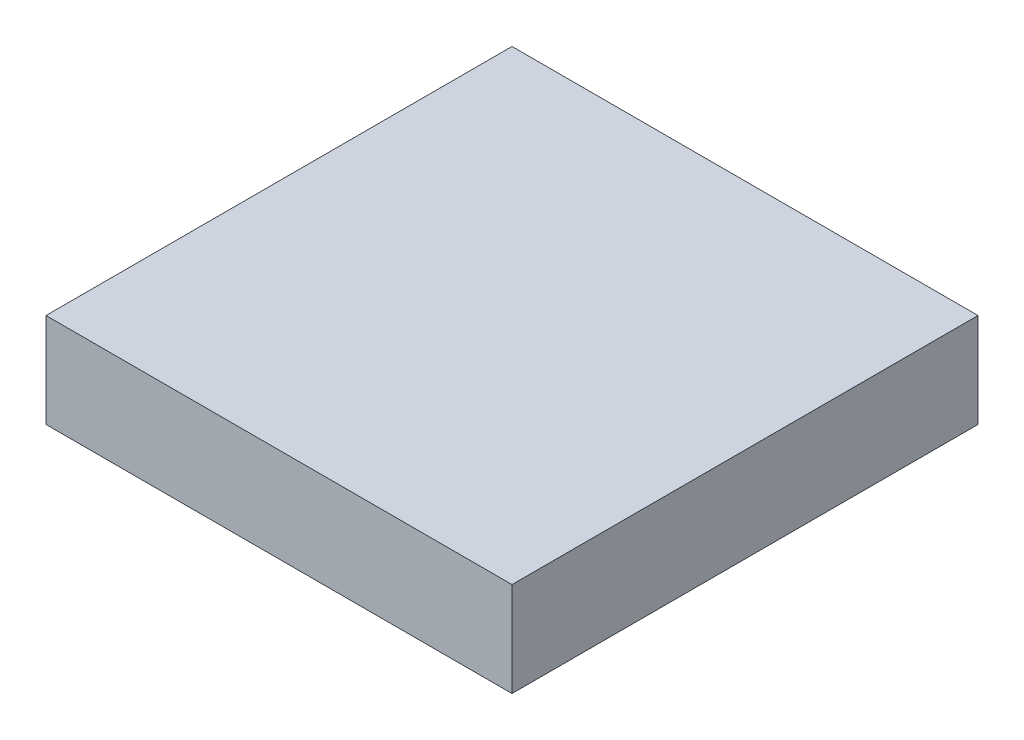
ISO-10303-21;
HEADER;
FILE_DESCRIPTION(('STEP AP214'),'2;1');
FILE_NAME('part.step','',(''),(''),'','','');
FILE_SCHEMA(('AUTOMOTIVE_DESIGN { 1 0 10303 214 1 1 1 1 }'));
ENDSEC;
DATA;
#1=APPLICATION_CONTEXT('core data for automotive mechanical design processes');
#2=APPLICATION_PROTOCOL_DEFINITION('international standard','automotive_design',2000,#1);
#3=PRODUCT_CONTEXT('',#1,'mechanical');
#4=PRODUCT('Part','Part','',(#3));
#5=PRODUCT_RELATED_PRODUCT_CATEGORY('part','',(#4));
#6=PRODUCT_DEFINITION_FORMATION('','',#4);
#7=PRODUCT_DEFINITION_CONTEXT('part definition',#1,'design');
#8=PRODUCT_DEFINITION('design','',#6,#7);
#9=PRODUCT_DEFINITION_SHAPE('','',#8);
#10=(LENGTH_UNIT() NAMED_UNIT(*) SI_UNIT(.MILLI.,.METRE.));
#11=(NAMED_UNIT(*) PLANE_ANGLE_UNIT() SI_UNIT($,.RADIAN.));
#12=(NAMED_UNIT(*) SI_UNIT($,.STERADIAN.) SOLID_ANGLE_UNIT());
#13=UNCERTAINTY_MEASURE_WITH_UNIT(LENGTH_MEASURE(1.E-05),#10,'distance_accuracy_value','');
#14=(GEOMETRIC_REPRESENTATION_CONTEXT(3) GLOBAL_UNCERTAINTY_ASSIGNED_CONTEXT((#13)) GLOBAL_UNIT_ASSIGNED_CONTEXT((#10,
#11,#12)) REPRESENTATION_CONTEXT('',''));
#15=CARTESIAN_POINT('',(0.,0.,0.));
#16=DIRECTION('',(0.,0.,1.));
#17=DIRECTION('',(1.,0.,0.));
#18=AXIS2_PLACEMENT_3D('',#15,#16,#17);
#19=CARTESIAN_POINT('',(0.,0.,0.));
#20=DIRECTION('',(0.,1.,0.));
#21=DIRECTION('',(0.,0.,1.));
#22=AXIS2_PLACEMENT_3D('',#19,#20,#21);
#23=PLANE('',#22);
#24=CARTESIAN_POINT('',(4.,0.,-4.));
#25=DIRECTION('',(0.,1.,0.));
#26=DIRECTION('',(0.,0.,1.));
#27=AXIS2_PLACEMENT_3D('',#24,#25,#26);
#28=CIRCLE('',#27,2.5);
#29=CARTESIAN_POINT('',(4.,0.,-1.5));
#30=VERTEX_POINT('',#29);
#31=EDGE_CURVE('E247',#30,#30,#28,.T.);
#32=ORIENTED_EDGE('',*,*,#31,.T.);
#33=EDGE_LOOP('',(#32));
#34=FACE_BOUND('',#33,.T.);
#35=CARTESIAN_POINT('',(-3.99999999999991,0.,4.00000000000005));
#36=DIRECTION('',(0.,1.,0.));
#37=DIRECTION('',(0.,0.,1.));
#38=AXIS2_PLACEMENT_3D('',#35,#36,#37);
#39=CIRCLE('',#38,2.5);
#40=CARTESIAN_POINT('',(-3.99999999999991,0.,6.50000000000005));
#41=VERTEX_POINT('',#40);
#42=EDGE_CURVE('E261',#41,#41,#39,.T.);
#43=ORIENTED_EDGE('',*,*,#42,.T.);
#44=EDGE_LOOP('',(#43));
#45=FACE_BOUND('',#44,.T.);
#46=DIRECTION('',(0.,0.,1.));
#47=VECTOR('',#46,1.);
#48=CARTESIAN_POINT('',(7.9,0.,0.));
#49=LINE('',#48,#47);
#50=CARTESIAN_POINT('',(7.9,0.,-7.9));
#51=VERTEX_POINT('',#50);
#52=CARTESIAN_POINT('',(7.9,0.,7.9));
#53=VERTEX_POINT('',#52);
#54=EDGE_CURVE('E102',#51,#53,#49,.T.);
#55=ORIENTED_EDGE('',*,*,#54,.T.);
#56=DIRECTION('',(1.,0.,0.));
#57=VECTOR('',#56,1.);
#58=CARTESIAN_POINT('',(0.,0.,7.9));
#59=LINE('',#58,#57);
#60=CARTESIAN_POINT('',(-7.9,0.,7.9));
#61=VERTEX_POINT('',#60);
#62=EDGE_CURVE('E97',#61,#53,#59,.T.);
#63=ORIENTED_EDGE('',*,*,#62,.F.);
#64=DIRECTION('',(0.,0.,1.));
#65=VECTOR('',#64,1.);
#66=CARTESIAN_POINT('',(-7.9,0.,0.));
#67=LINE('',#66,#65);
#68=CARTESIAN_POINT('',(-7.9,0.,-7.9));
#69=VERTEX_POINT('',#68);
#70=EDGE_CURVE('E69',#69,#61,#67,.T.);
#71=ORIENTED_EDGE('',*,*,#70,.F.);
#72=DIRECTION('',(1.,0.,0.));
#73=VECTOR('',#72,1.);
#74=CARTESIAN_POINT('',(0.,0.,-7.9));
#75=LINE('',#74,#73);
#76=EDGE_CURVE('E89',#69,#51,#75,.T.);
#77=ORIENTED_EDGE('',*,*,#76,.T.);
#78=EDGE_LOOP('',(#55,#63,#71,#77));
#79=FACE_BOUND('',#78,.T.);
#80=CARTESIAN_POINT('',(4.00000000000009,0.,4.));
#81=DIRECTION('',(0.,1.,0.));
#82=DIRECTION('',(0.,0.,1.));
#83=AXIS2_PLACEMENT_3D('',#80,#81,#82);
#84=CIRCLE('',#83,2.5);
#85=CARTESIAN_POINT('',(4.00000000000009,0.,6.5));
#86=VERTEX_POINT('',#85);
#87=EDGE_CURVE('E256',#86,#86,#84,.T.);
#88=ORIENTED_EDGE('',*,*,#87,.T.);
#89=EDGE_LOOP('',(#88));
#90=FACE_BOUND('',#89,.T.);
#91=CARTESIAN_POINT('',(-4.,0.,-3.99999999999995));
#92=DIRECTION('',(0.,1.,0.));
#93=DIRECTION('',(0.,0.,1.));
#94=AXIS2_PLACEMENT_3D('',#91,#92,#93);
#95=CIRCLE('',#94,2.5);
#96=CARTESIAN_POINT('',(-4.,0.,-1.49999999999995));
#97=VERTEX_POINT('',#96);
#98=EDGE_CURVE('E248',#97,#97,#95,.T.);
#99=ORIENTED_EDGE('',*,*,#98,.T.);
#100=EDGE_LOOP('',(#99));
#101=FACE_BOUND('',#100,.T.);
#102=ADVANCED_FACE('F37',(#34,#45,#79,#90,#101),#23,.F.);
#103=CARTESIAN_POINT('',(7.9,3.2,0.));
#104=DIRECTION('',(1.,0.,0.));
#105=DIRECTION('',(0.,0.,-1.));
#106=AXIS2_PLACEMENT_3D('',#103,#104,#105);
#107=PLANE('',#106);
#108=ORIENTED_EDGE('',*,*,#54,.F.);
#109=DIRECTION('',(0.,-1.,0.));
#110=VECTOR('',#109,1.);
#111=CARTESIAN_POINT('',(7.9,3.2,-7.9));
#112=LINE('',#111,#110);
#113=CARTESIAN_POINT('',(7.9,3.2,-7.9));
#114=VERTEX_POINT('',#113);
#115=EDGE_CURVE('E11',#114,#51,#112,.T.);
#116=ORIENTED_EDGE('',*,*,#115,.F.);
#117=DIRECTION('',(0.,0.,1.));
#118=VECTOR('',#117,1.);
#119=CARTESIAN_POINT('',(7.9,3.2,0.));
#120=LINE('',#119,#118);
#121=CARTESIAN_POINT('',(7.9,3.2,7.9));
#122=VERTEX_POINT('',#121);
#123=EDGE_CURVE('E95',#114,#122,#120,.T.);
#124=ORIENTED_EDGE('',*,*,#123,.T.);
#125=DIRECTION('',(0.,-1.,0.));
#126=VECTOR('',#125,1.);
#127=CARTESIAN_POINT('',(7.9,3.2,7.9));
#128=LINE('',#127,#126);
#129=EDGE_CURVE('E76',#122,#53,#128,.T.);
#130=ORIENTED_EDGE('',*,*,#129,.T.);
#131=EDGE_LOOP('',(#108,#116,#124,#130));
#132=FACE_BOUND('',#131,.T.);
#133=ADVANCED_FACE('F39',(#132),#107,.T.);
#134=CARTESIAN_POINT('',(0.,3.2,-7.9));
#135=DIRECTION('',(0.,0.,-1.));
#136=DIRECTION('',(-1.,0.,0.));
#137=AXIS2_PLACEMENT_3D('',#134,#135,#136);
#138=PLANE('',#137);
#139=ORIENTED_EDGE('',*,*,#76,.F.);
#140=DIRECTION('',(0.,-1.,0.));
#141=VECTOR('',#140,1.);
#142=CARTESIAN_POINT('',(-7.9,3.2,-7.9));
#143=LINE('',#142,#141);
#144=CARTESIAN_POINT('',(-7.9,3.2,-7.9));
#145=VERTEX_POINT('',#144);
#146=EDGE_CURVE('E46',#145,#69,#143,.T.);
#147=ORIENTED_EDGE('',*,*,#146,.F.);
#148=DIRECTION('',(1.,0.,0.));
#149=VECTOR('',#148,1.);
#150=CARTESIAN_POINT('',(0.,3.2,-7.9));
#151=LINE('',#150,#149);
#152=EDGE_CURVE('E87',#145,#114,#151,.T.);
#153=ORIENTED_EDGE('',*,*,#152,.T.);
#154=ORIENTED_EDGE('',*,*,#115,.T.);
#155=EDGE_LOOP('',(#139,#147,#153,#154));
#156=FACE_BOUND('',#155,.T.);
#157=ADVANCED_FACE('F85',(#156),#138,.T.);
#158=CARTESIAN_POINT('',(-7.9,3.2,0.));
#159=DIRECTION('',(1.,0.,0.));
#160=DIRECTION('',(0.,0.,-1.));
#161=AXIS2_PLACEMENT_3D('',#158,#159,#160);
#162=PLANE('',#161);
#163=ORIENTED_EDGE('',*,*,#70,.T.);
#164=DIRECTION('',(0.,-1.,0.));
#165=VECTOR('',#164,1.);
#166=CARTESIAN_POINT('',(-7.9,3.2,7.9));
#167=LINE('',#166,#165);
#168=CARTESIAN_POINT('',(-7.9,3.2,7.9));
#169=VERTEX_POINT('',#168);
#170=EDGE_CURVE('E90',#169,#61,#167,.T.);
#171=ORIENTED_EDGE('',*,*,#170,.F.);
#172=DIRECTION('',(0.,0.,1.));
#173=VECTOR('',#172,1.);
#174=CARTESIAN_POINT('',(-7.9,3.2,0.));
#175=LINE('',#174,#173);
#176=EDGE_CURVE('E91',#145,#169,#175,.T.);
#177=ORIENTED_EDGE('',*,*,#176,.F.);
#178=ORIENTED_EDGE('',*,*,#146,.T.);
#179=EDGE_LOOP('',(#163,#171,#177,#178));
#180=FACE_BOUND('',#179,.T.);
#181=ADVANCED_FACE('F92',(#180),#162,.F.);
#182=CARTESIAN_POINT('',(0.,3.2,7.9));
#183=DIRECTION('',(0.,0.,-1.));
#184=DIRECTION('',(-1.,0.,0.));
#185=AXIS2_PLACEMENT_3D('',#182,#183,#184);
#186=PLANE('',#185);
#187=ORIENTED_EDGE('',*,*,#62,.T.);
#188=ORIENTED_EDGE('',*,*,#129,.F.);
#189=DIRECTION('',(1.,0.,0.));
#190=VECTOR('',#189,1.);
#191=CARTESIAN_POINT('',(0.,3.2,7.9));
#192=LINE('',#191,#190);
#193=EDGE_CURVE('E54',#169,#122,#192,.T.);
#194=ORIENTED_EDGE('',*,*,#193,.F.);
#195=ORIENTED_EDGE('',*,*,#170,.T.);
#196=EDGE_LOOP('',(#187,#188,#194,#195));
#197=FACE_BOUND('',#196,.T.);
#198=ADVANCED_FACE('F112',(#197),#186,.F.);
#199=CARTESIAN_POINT('',(0.,3.2,0.));
#200=DIRECTION('',(0.,1.,0.));
#201=DIRECTION('',(0.,0.,1.));
#202=AXIS2_PLACEMENT_3D('',#199,#200,#201);
#203=PLANE('',#202);
#204=ORIENTED_EDGE('',*,*,#123,.F.);
#205=ORIENTED_EDGE('',*,*,#152,.F.);
#206=ORIENTED_EDGE('',*,*,#176,.T.);
#207=ORIENTED_EDGE('',*,*,#193,.T.);
#208=EDGE_LOOP('',(#204,#205,#206,#207));
#209=FACE_BOUND('',#208,.T.);
#210=ADVANCED_FACE('F94',(#209),#203,.T.);
#211=CARTESIAN_POINT('',(-3.99999999999991,1.8,4.00000000000005));
#212=DIRECTION('',(0.,-1.,0.));
#213=DIRECTION('',(0.,0.,-1.));
#214=AXIS2_PLACEMENT_3D('',#211,#212,#213);
#215=CYLINDRICAL_SURFACE('',#214,2.5);
#216=CARTESIAN_POINT('',(-3.99999999999991,1.8,4.00000000000005));
#217=DIRECTION('',(0.,1.,0.));
#218=DIRECTION('',(0.,0.,1.));
#219=AXIS2_PLACEMENT_3D('',#216,#217,#218);
#220=CIRCLE('',#219,2.5);
#221=CARTESIAN_POINT('',(-3.99999999999991,1.8,6.50000000000005));
#222=VERTEX_POINT('',#221);
#223=EDGE_CURVE('E105',#222,#222,#220,.T.);
#224=ORIENTED_EDGE('',*,*,#223,.T.);
#225=EDGE_LOOP('',(#224));
#226=FACE_BOUND('',#225,.T.);
#227=ORIENTED_EDGE('',*,*,#42,.F.);
#228=EDGE_LOOP('',(#227));
#229=FACE_BOUND('',#228,.T.);
#230=ADVANCED_FACE('F146',(#226,#229),#215,.F.);
#231=CARTESIAN_POINT('',(0.,1.8,0.));
#232=DIRECTION('',(0.,1.,0.));
#233=DIRECTION('',(0.,0.,1.));
#234=AXIS2_PLACEMENT_3D('',#231,#232,#233);
#235=PLANE('',#234);
#236=ORIENTED_EDGE('',*,*,#223,.F.);
#237=EDGE_LOOP('',(#236));
#238=FACE_BOUND('',#237,.T.);
#239=ADVANCED_FACE('F152',(#238),#235,.F.);
#240=CARTESIAN_POINT('',(4.00000000000009,1.8,4.));
#241=DIRECTION('',(0.,-1.,0.));
#242=DIRECTION('',(0.,0.,-1.));
#243=AXIS2_PLACEMENT_3D('',#240,#241,#242);
#244=CYLINDRICAL_SURFACE('',#243,2.5);
#245=CARTESIAN_POINT('',(4.00000000000009,1.8,4.));
#246=DIRECTION('',(0.,1.,0.));
#247=DIRECTION('',(0.,0.,1.));
#248=AXIS2_PLACEMENT_3D('',#245,#246,#247);
#249=CIRCLE('',#248,2.5);
#250=CARTESIAN_POINT('',(4.00000000000009,1.8,6.5));
#251=VERTEX_POINT('',#250);
#252=EDGE_CURVE('E258',#251,#251,#249,.T.);
#253=ORIENTED_EDGE('',*,*,#252,.T.);
#254=EDGE_LOOP('',(#253));
#255=FACE_BOUND('',#254,.T.);
#256=ORIENTED_EDGE('',*,*,#87,.F.);
#257=EDGE_LOOP('',(#256));
#258=FACE_BOUND('',#257,.T.);
#259=ADVANCED_FACE('F159',(#255,#258),#244,.F.);
#260=CARTESIAN_POINT('',(0.,1.8,0.));
#261=DIRECTION('',(0.,1.,0.));
#262=DIRECTION('',(0.,0.,1.));
#263=AXIS2_PLACEMENT_3D('',#260,#261,#262);
#264=PLANE('',#263);
#265=ORIENTED_EDGE('',*,*,#252,.F.);
#266=EDGE_LOOP('',(#265));
#267=FACE_BOUND('',#266,.T.);
#268=ADVANCED_FACE('F167',(#267),#264,.F.);
#269=CARTESIAN_POINT('',(4.,1.8,-4.));
#270=DIRECTION('',(0.,-1.,0.));
#271=DIRECTION('',(0.,0.,-1.));
#272=AXIS2_PLACEMENT_3D('',#269,#270,#271);
#273=CYLINDRICAL_SURFACE('',#272,2.5);
#274=CARTESIAN_POINT('',(4.,1.8,-4.));
#275=DIRECTION('',(0.,1.,0.));
#276=DIRECTION('',(0.,0.,1.));
#277=AXIS2_PLACEMENT_3D('',#274,#275,#276);
#278=CIRCLE('',#277,2.5);
#279=CARTESIAN_POINT('',(4.,1.8,-1.5));
#280=VERTEX_POINT('',#279);
#281=EDGE_CURVE('E250',#280,#280,#278,.T.);
#282=ORIENTED_EDGE('',*,*,#281,.T.);
#283=EDGE_LOOP('',(#282));
#284=FACE_BOUND('',#283,.T.);
#285=ORIENTED_EDGE('',*,*,#31,.F.);
#286=EDGE_LOOP('',(#285));
#287=FACE_BOUND('',#286,.T.);
#288=ADVANCED_FACE('F175',(#284,#287),#273,.F.);
#289=CARTESIAN_POINT('',(0.,1.8,0.));
#290=DIRECTION('',(0.,1.,0.));
#291=DIRECTION('',(0.,0.,1.));
#292=AXIS2_PLACEMENT_3D('',#289,#290,#291);
#293=PLANE('',#292);
#294=ORIENTED_EDGE('',*,*,#281,.F.);
#295=EDGE_LOOP('',(#294));
#296=FACE_BOUND('',#295,.T.);
#297=ADVANCED_FACE('F183',(#296),#293,.F.);
#298=CARTESIAN_POINT('',(-4.,1.8,-3.99999999999995));
#299=DIRECTION('',(0.,-1.,0.));
#300=DIRECTION('',(0.,0.,-1.));
#301=AXIS2_PLACEMENT_3D('',#298,#299,#300);
#302=CYLINDRICAL_SURFACE('',#301,2.5);
#303=CARTESIAN_POINT('',(-4.,1.8,-3.99999999999995));
#304=DIRECTION('',(0.,1.,0.));
#305=DIRECTION('',(0.,0.,1.));
#306=AXIS2_PLACEMENT_3D('',#303,#304,#305);
#307=CIRCLE('',#306,2.5);
#308=CARTESIAN_POINT('',(-4.,1.8,-1.49999999999995));
#309=VERTEX_POINT('',#308);
#310=EDGE_CURVE('E246',#309,#309,#307,.T.);
#311=ORIENTED_EDGE('',*,*,#310,.T.);
#312=EDGE_LOOP('',(#311));
#313=FACE_BOUND('',#312,.T.);
#314=ORIENTED_EDGE('',*,*,#98,.F.);
#315=EDGE_LOOP('',(#314));
#316=FACE_BOUND('',#315,.T.);
#317=ADVANCED_FACE('F191',(#313,#316),#302,.F.);
#318=CARTESIAN_POINT('',(0.,1.8,0.));
#319=DIRECTION('',(0.,1.,0.));
#320=DIRECTION('',(0.,0.,1.));
#321=AXIS2_PLACEMENT_3D('',#318,#319,#320);
#322=PLANE('',#321);
#323=ORIENTED_EDGE('',*,*,#310,.F.);
#324=EDGE_LOOP('',(#323));
#325=FACE_BOUND('',#324,.T.);
#326=ADVANCED_FACE('F199',(#325),#322,.F.);
#327=CLOSED_SHELL('',(#102,#133,#157,#181,#198,#210,#230,#239,#259,#268,#288,#297,#317,#326));
#328=MANIFOLD_SOLID_BREP('B2',#327);
#329=ADVANCED_BREP_SHAPE_REPRESENTATION('',(#18,#328),#14);
#330=SHAPE_DEFINITION_REPRESENTATION(#9,#329);
ENDSEC;
END-ISO-10303-21;
